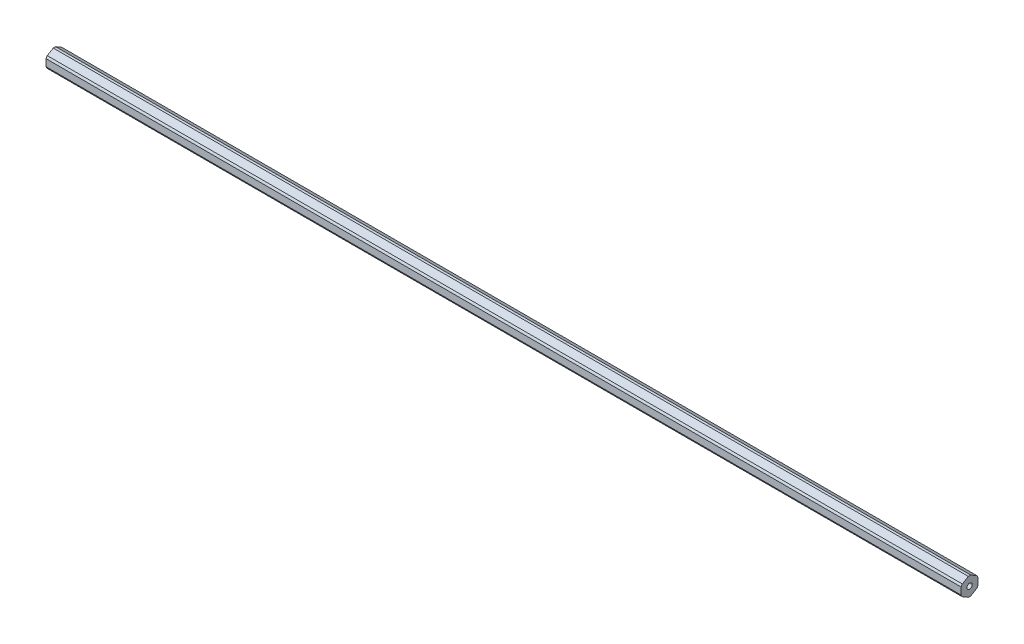
ISO-10303-21;
HEADER;
FILE_DESCRIPTION(('STEP AP214'),'2;1');
FILE_NAME('part.step','',(''),(''),'','','');
FILE_SCHEMA(('AUTOMOTIVE_DESIGN { 1 0 10303 214 1 1 1 1 }'));
ENDSEC;
DATA;
#1=APPLICATION_CONTEXT('core data for automotive mechanical design processes');
#2=APPLICATION_PROTOCOL_DEFINITION('international standard','automotive_design',2000,#1);
#3=PRODUCT_CONTEXT('',#1,'mechanical');
#4=PRODUCT('Part','Part','',(#3));
#5=PRODUCT_RELATED_PRODUCT_CATEGORY('part','',(#4));
#6=PRODUCT_DEFINITION_FORMATION('','',#4);
#7=PRODUCT_DEFINITION_CONTEXT('part definition',#1,'design');
#8=PRODUCT_DEFINITION('design','',#6,#7);
#9=PRODUCT_DEFINITION_SHAPE('','',#8);
#10=(LENGTH_UNIT() NAMED_UNIT(*) SI_UNIT(.MILLI.,.METRE.));
#11=(NAMED_UNIT(*) PLANE_ANGLE_UNIT() SI_UNIT($,.RADIAN.));
#12=(NAMED_UNIT(*) SI_UNIT($,.STERADIAN.) SOLID_ANGLE_UNIT());
#13=UNCERTAINTY_MEASURE_WITH_UNIT(LENGTH_MEASURE(1.E-05),#10,'distance_accuracy_value','');
#14=(GEOMETRIC_REPRESENTATION_CONTEXT(3) GLOBAL_UNCERTAINTY_ASSIGNED_CONTEXT((#13)) GLOBAL_UNIT_ASSIGNED_CONTEXT((#10,
#11,#12)) REPRESENTATION_CONTEXT('',''));
#15=CARTESIAN_POINT('',(0.,0.,0.));
#16=DIRECTION('',(0.,0.,1.));
#17=DIRECTION('',(1.,0.,0.));
#18=AXIS2_PLACEMENT_3D('',#15,#16,#17);
#19=CARTESIAN_POINT('',(344.4875,-42.7410300776045,144.981734412357));
#20=DIRECTION('',(0.,-0.866025403784439,0.5));
#21=DIRECTION('',(0.,-0.5,-0.866025403784439));
#22=AXIS2_PLACEMENT_3D('',#19,#20,#21);
#23=PLANE('',#22);
#24=DIRECTION('',(0.,0.5,0.866025403784439));
#25=VECTOR('',#24,1.);
#26=CARTESIAN_POINT('',(344.4875,-42.7410300776045,144.981734412357));
#27=LINE('',#26,#25);
#28=CARTESIAN_POINT('',(344.4875,-44.0578613347992,142.700915769901));
#29=VERTEX_POINT('',#28);
#30=CARTESIAN_POINT('',(344.4875,-41.4241988204098,147.262553054813));
#31=VERTEX_POINT('',#30);
#32=EDGE_CURVE('E193',#29,#31,#27,.T.);
#33=ORIENTED_EDGE('',*,*,#32,.T.);
#34=DIRECTION('',(-1.,0.,0.));
#35=VECTOR('',#34,1.);
#36=CARTESIAN_POINT('',(344.4875,-41.4241988204098,147.262553054813));
#37=LINE('',#36,#35);
#38=CARTESIAN_POINT('',(-344.4875,-41.4241988204097,147.262553054813));
#39=VERTEX_POINT('',#38);
#40=EDGE_CURVE('E186',#31,#39,#37,.T.);
#41=ORIENTED_EDGE('',*,*,#40,.T.);
#42=DIRECTION('',(0.,-0.5,-0.866025403784438));
#43=VECTOR('',#42,1.);
#44=CARTESIAN_POINT('',(-344.4875,-42.7410300776044,144.981734412357));
#45=LINE('',#44,#43);
#46=CARTESIAN_POINT('',(-344.4875,-44.0578613347991,142.700915769901));
#47=VERTEX_POINT('',#46);
#48=EDGE_CURVE('E139',#39,#47,#45,.T.);
#49=ORIENTED_EDGE('',*,*,#48,.T.);
#50=DIRECTION('',(-1.,0.,0.));
#51=VECTOR('',#50,1.);
#52=CARTESIAN_POINT('',(344.4875,-44.0578613347993,142.700915769901));
#53=LINE('',#52,#51);
#54=EDGE_CURVE('E182',#47,#29,#53,.F.);
#55=ORIENTED_EDGE('',*,*,#54,.T.);
#56=EDGE_LOOP('',(#33,#41,#49,#55));
#57=FACE_BOUND('',#56,.T.);
#58=ADVANCED_FACE('F17',(#57),#23,.T.);
#59=CARTESIAN_POINT('',(344.4875,-37.2412950776045,148.157007895079));
#60=DIRECTION('',(0.,0.,1.));
#61=DIRECTION('',(1.,0.,0.));
#62=AXIS2_PLACEMENT_3D('',#59,#60,#61);
#63=PLANE('',#62);
#64=DIRECTION('',(0.,1.,0.));
#65=VECTOR('',#64,1.);
#66=CARTESIAN_POINT('',(344.4875,-37.2412950776045,148.157007895079));
#67=LINE('',#66,#65);
#68=CARTESIAN_POINT('',(344.4875,-39.874957591994,148.157007895079));
#69=VERTEX_POINT('',#68);
#70=CARTESIAN_POINT('',(344.4875,-34.6076325632151,148.157007895079));
#71=VERTEX_POINT('',#70);
#72=EDGE_CURVE('E196',#69,#71,#67,.T.);
#73=ORIENTED_EDGE('',*,*,#72,.T.);
#74=DIRECTION('',(-1.,0.,0.));
#75=VECTOR('',#74,1.);
#76=CARTESIAN_POINT('',(344.4875,-34.6076325632151,148.157007895079));
#77=LINE('',#76,#75);
#78=CARTESIAN_POINT('',(-344.4875,-34.6076325632149,148.157007895079));
#79=VERTEX_POINT('',#78);
#80=EDGE_CURVE('E179',#71,#79,#77,.T.);
#81=ORIENTED_EDGE('',*,*,#80,.T.);
#82=DIRECTION('',(0.,-1.,0.));
#83=VECTOR('',#82,1.);
#84=CARTESIAN_POINT('',(-344.4875,-37.2412950776044,148.157007895079));
#85=LINE('',#84,#83);
#86=CARTESIAN_POINT('',(-344.4875,-39.8749575919938,148.157007895079));
#87=VERTEX_POINT('',#86);
#88=EDGE_CURVE('E124',#79,#87,#85,.T.);
#89=ORIENTED_EDGE('',*,*,#88,.T.);
#90=DIRECTION('',(-1.,0.,0.));
#91=VECTOR('',#90,1.);
#92=CARTESIAN_POINT('',(344.4875,-39.874957591994,148.157007895079));
#93=LINE('',#92,#91);
#94=EDGE_CURVE('E176',#87,#69,#93,.F.);
#95=ORIENTED_EDGE('',*,*,#94,.T.);
#96=EDGE_LOOP('',(#73,#81,#89,#95));
#97=FACE_BOUND('',#96,.T.);
#98=ADVANCED_FACE('F264',(#97),#63,.T.);
#99=CARTESIAN_POINT('',(344.4875,-31.7415600776046,144.981734412357));
#100=DIRECTION('',(0.,0.866025403784439,0.5));
#101=DIRECTION('',(0.,-0.5,0.866025403784439));
#102=AXIS2_PLACEMENT_3D('',#99,#100,#101);
#103=PLANE('',#102);
#104=DIRECTION('',(0.,0.5,-0.866025403784439));
#105=VECTOR('',#104,1.);
#106=CARTESIAN_POINT('',(344.4875,-31.7415600776046,144.981734412357));
#107=LINE('',#106,#105);
#108=CARTESIAN_POINT('',(344.4875,-33.0583913347992,147.262553054813));
#109=VERTEX_POINT('',#108);
#110=CARTESIAN_POINT('',(344.4875,-30.4247288204099,142.700915769901));
#111=VERTEX_POINT('',#110);
#112=EDGE_CURVE('E200',#109,#111,#107,.T.);
#113=ORIENTED_EDGE('',*,*,#112,.T.);
#114=DIRECTION('',(-1.,0.,0.));
#115=VECTOR('',#114,1.);
#116=CARTESIAN_POINT('',(344.4875,-30.4247288204099,142.700915769901));
#117=LINE('',#116,#115);
#118=CARTESIAN_POINT('',(-344.4875,-30.4247288204097,142.700915769901));
#119=VERTEX_POINT('',#118);
#120=EDGE_CURVE('E114',#111,#119,#117,.T.);
#121=ORIENTED_EDGE('',*,*,#120,.T.);
#122=DIRECTION('',(0.,-0.5,0.866025403784439));
#123=VECTOR('',#122,1.);
#124=CARTESIAN_POINT('',(-344.4875,-31.7415600776044,144.981734412357));
#125=LINE('',#124,#123);
#126=CARTESIAN_POINT('',(-344.4875,-33.0583913347991,147.262553054813));
#127=VERTEX_POINT('',#126);
#128=EDGE_CURVE('E121',#119,#127,#125,.T.);
#129=ORIENTED_EDGE('',*,*,#128,.T.);
#130=DIRECTION('',(-1.,0.,0.));
#131=VECTOR('',#130,1.);
#132=CARTESIAN_POINT('',(344.4875,-33.0583913347993,147.262553054813));
#133=LINE('',#132,#131);
#134=EDGE_CURVE('E104',#127,#109,#133,.F.);
#135=ORIENTED_EDGE('',*,*,#134,.T.);
#136=EDGE_LOOP('',(#113,#121,#129,#135));
#137=FACE_BOUND('',#136,.T.);
#138=ADVANCED_FACE('F130',(#137),#103,.T.);
#139=CARTESIAN_POINT('',(344.4875,-31.7415600776046,138.631187446914));
#140=DIRECTION('',(0.,0.866025403784439,-0.5));
#141=DIRECTION('',(0.,0.5,0.866025403784439));
#142=AXIS2_PLACEMENT_3D('',#139,#140,#141);
#143=PLANE('',#142);
#144=DIRECTION('',(0.,-0.5,-0.866025403784439));
#145=VECTOR('',#144,1.);
#146=CARTESIAN_POINT('',(344.4875,-31.7415600776046,138.631187446914));
#147=LINE('',#146,#145);
#148=CARTESIAN_POINT('',(344.4875,-30.4247288204099,140.91200608937));
#149=VERTEX_POINT('',#148);
#150=CARTESIAN_POINT('',(344.4875,-33.0583913347992,136.350368804458));
#151=VERTEX_POINT('',#150);
#152=EDGE_CURVE('E203',#149,#151,#147,.T.);
#153=ORIENTED_EDGE('',*,*,#152,.T.);
#154=DIRECTION('',(-1.,0.,0.));
#155=VECTOR('',#154,1.);
#156=CARTESIAN_POINT('',(344.4875,-33.0583913347993,136.350368804458));
#157=LINE('',#156,#155);
#158=CARTESIAN_POINT('',(-344.4875,-33.0583913347991,136.350368804458));
#159=VERTEX_POINT('',#158);
#160=EDGE_CURVE('E115',#151,#159,#157,.T.);
#161=ORIENTED_EDGE('',*,*,#160,.T.);
#162=DIRECTION('',(0.,0.5,0.866025403784439));
#163=VECTOR('',#162,1.);
#164=CARTESIAN_POINT('',(-344.4875,-31.7415600776044,138.631187446914));
#165=LINE('',#164,#163);
#166=CARTESIAN_POINT('',(-344.4875,-30.4247288204097,140.91200608937));
#167=VERTEX_POINT('',#166);
#168=EDGE_CURVE('E133',#159,#167,#165,.T.);
#169=ORIENTED_EDGE('',*,*,#168,.T.);
#170=DIRECTION('',(-1.,0.,0.));
#171=VECTOR('',#170,1.);
#172=CARTESIAN_POINT('',(344.4875,-30.4247288204099,140.91200608937));
#173=LINE('',#172,#171);
#174=EDGE_CURVE('E168',#167,#149,#173,.F.);
#175=ORIENTED_EDGE('',*,*,#174,.T.);
#176=EDGE_LOOP('',(#153,#161,#169,#175));
#177=FACE_BOUND('',#176,.T.);
#178=ADVANCED_FACE('F270',(#177),#143,.T.);
#179=CARTESIAN_POINT('',(344.4875,-37.2412950776045,135.455913964192));
#180=DIRECTION('',(0.,0.,-1.));
#181=DIRECTION('',(-1.,0.,0.));
#182=AXIS2_PLACEMENT_3D('',#179,#180,#181);
#183=PLANE('',#182);
#184=DIRECTION('',(0.,-1.,0.));
#185=VECTOR('',#184,1.);
#186=CARTESIAN_POINT('',(344.4875,-37.2412950776045,135.455913964192));
#187=LINE('',#186,#185);
#188=CARTESIAN_POINT('',(344.4875,-34.6076325632151,135.455913964192));
#189=VERTEX_POINT('',#188);
#190=CARTESIAN_POINT('',(344.4875,-39.874957591994,135.455913964192));
#191=VERTEX_POINT('',#190);
#192=EDGE_CURVE('E25',#189,#191,#187,.T.);
#193=ORIENTED_EDGE('',*,*,#192,.T.);
#194=DIRECTION('',(-1.,0.,0.));
#195=VECTOR('',#194,1.);
#196=CARTESIAN_POINT('',(344.4875,-39.874957591994,135.455913964192));
#197=LINE('',#196,#195);
#198=CARTESIAN_POINT('',(-344.4875,-39.8749575919938,135.455913964192));
#199=VERTEX_POINT('',#198);
#200=EDGE_CURVE('E165',#191,#199,#197,.T.);
#201=ORIENTED_EDGE('',*,*,#200,.T.);
#202=DIRECTION('',(0.,1.,0.));
#203=VECTOR('',#202,1.);
#204=CARTESIAN_POINT('',(-344.4875,-37.2412950776044,135.455913964192));
#205=LINE('',#204,#203);
#206=CARTESIAN_POINT('',(-344.4875,-34.6076325632149,135.455913964192));
#207=VERTEX_POINT('',#206);
#208=EDGE_CURVE('E143',#199,#207,#205,.T.);
#209=ORIENTED_EDGE('',*,*,#208,.T.);
#210=DIRECTION('',(-1.,0.,0.));
#211=VECTOR('',#210,1.);
#212=CARTESIAN_POINT('',(344.4875,-34.6076325632151,135.455913964192));
#213=LINE('',#212,#211);
#214=EDGE_CURVE('E161',#207,#189,#213,.F.);
#215=ORIENTED_EDGE('',*,*,#214,.T.);
#216=EDGE_LOOP('',(#193,#201,#209,#215));
#217=FACE_BOUND('',#216,.T.);
#218=ADVANCED_FACE('F211',(#217),#183,.T.);
#219=CARTESIAN_POINT('',(344.4875,-42.7410300776045,138.631187446914));
#220=DIRECTION('',(0.,-0.866025403784438,-0.5));
#221=DIRECTION('',(0.,0.5,-0.866025403784438));
#222=AXIS2_PLACEMENT_3D('',#219,#220,#221);
#223=PLANE('',#222);
#224=DIRECTION('',(0.,-0.5,0.866025403784438));
#225=VECTOR('',#224,1.);
#226=CARTESIAN_POINT('',(344.4875,-42.7410300776045,138.631187446914));
#227=LINE('',#226,#225);
#228=CARTESIAN_POINT('',(344.4875,-41.4241988204098,136.350368804458));
#229=VERTEX_POINT('',#228);
#230=CARTESIAN_POINT('',(344.4875,-44.0578613347992,140.91200608937));
#231=VERTEX_POINT('',#230);
#232=EDGE_CURVE('E11',#229,#231,#227,.T.);
#233=ORIENTED_EDGE('',*,*,#232,.T.);
#234=DIRECTION('',(-1.,0.,0.));
#235=VECTOR('',#234,1.);
#236=CARTESIAN_POINT('',(344.4875,-44.0578613347992,140.91200608937));
#237=LINE('',#236,#235);
#238=CARTESIAN_POINT('',(-344.4875,-44.0578613347991,140.91200608937));
#239=VERTEX_POINT('',#238);
#240=EDGE_CURVE('E158',#231,#239,#237,.T.);
#241=ORIENTED_EDGE('',*,*,#240,.T.);
#242=DIRECTION('',(0.,0.5,-0.866025403784439));
#243=VECTOR('',#242,1.);
#244=CARTESIAN_POINT('',(-344.4875,-42.7410300776044,138.631187446914));
#245=LINE('',#244,#243);
#246=CARTESIAN_POINT('',(-344.4875,-41.4241988204097,136.350368804458));
#247=VERTEX_POINT('',#246);
#248=EDGE_CURVE('E233',#239,#247,#245,.T.);
#249=ORIENTED_EDGE('',*,*,#248,.T.);
#250=DIRECTION('',(-1.,0.,0.));
#251=VECTOR('',#250,1.);
#252=CARTESIAN_POINT('',(344.4875,-41.4241988204098,136.350368804458));
#253=LINE('',#252,#251);
#254=EDGE_CURVE('E154',#247,#229,#253,.F.);
#255=ORIENTED_EDGE('',*,*,#254,.T.);
#256=EDGE_LOOP('',(#233,#241,#249,#255));
#257=FACE_BOUND('',#256,.T.);
#258=ADVANCED_FACE('F278',(#257),#223,.T.);
#259=CARTESIAN_POINT('',(344.4875,-37.2412950776045,141.806460929636));
#260=DIRECTION('',(-1.,0.,0.));
#261=DIRECTION('',(0.,-1.,0.));
#262=AXIS2_PLACEMENT_3D('',#259,#260,#261);
#263=PLANE('',#262);
#264=CARTESIAN_POINT('',(344.4875,-37.2412950776045,141.806460929636));
#265=DIRECTION('',(-1.,0.,0.));
#266=DIRECTION('',(0.,-1.,0.));
#267=AXIS2_PLACEMENT_3D('',#264,#265,#266);
#268=CIRCLE('',#267,2.);
#269=CARTESIAN_POINT('',(344.4875,-39.2412950776045,141.806460929636));
#270=VERTEX_POINT('',#269);
#271=EDGE_CURVE('E189',#270,#270,#268,.T.);
#272=ORIENTED_EDGE('',*,*,#271,.T.);
#273=EDGE_LOOP('',(#272));
#274=FACE_BOUND('',#273,.T.);
#275=CARTESIAN_POINT('',(344.4875,-37.2412950776045,141.806460929636));
#276=DIRECTION('',(-1.,0.,0.));
#277=DIRECTION('',(0.,-1.,0.));
#278=AXIS2_PLACEMENT_3D('',#275,#276,#277);
#279=CIRCLE('',#278,6.875);
#280=EDGE_CURVE('E32',#31,#69,#279,.T.);
#281=ORIENTED_EDGE('',*,*,#280,.F.);
#282=ORIENTED_EDGE('',*,*,#32,.F.);
#283=EDGE_CURVE('E150',#231,#29,#279,.T.);
#284=ORIENTED_EDGE('',*,*,#283,.F.);
#285=ORIENTED_EDGE('',*,*,#232,.F.);
#286=EDGE_CURVE('E153',#191,#229,#279,.T.);
#287=ORIENTED_EDGE('',*,*,#286,.F.);
#288=ORIENTED_EDGE('',*,*,#192,.F.);
#289=EDGE_CURVE('E219',#151,#189,#279,.T.);
#290=ORIENTED_EDGE('',*,*,#289,.F.);
#291=ORIENTED_EDGE('',*,*,#152,.F.);
#292=EDGE_CURVE('E225',#111,#149,#279,.T.);
#293=ORIENTED_EDGE('',*,*,#292,.F.);
#294=ORIENTED_EDGE('',*,*,#112,.F.);
#295=EDGE_CURVE('E40',#71,#109,#279,.T.);
#296=ORIENTED_EDGE('',*,*,#295,.F.);
#297=ORIENTED_EDGE('',*,*,#72,.F.);
#298=EDGE_LOOP('',(#281,#282,#284,#285,#287,#288,#290,#291,#293,#294,#296,#297));
#299=FACE_BOUND('',#298,.T.);
#300=ADVANCED_FACE('F217',(#274,#299),#263,.F.);
#301=CARTESIAN_POINT('',(344.4875,-37.2412950776045,141.806460929636));
#302=DIRECTION('',(-1.,0.,0.));
#303=DIRECTION('',(0.,-1.,0.));
#304=AXIS2_PLACEMENT_3D('',#301,#302,#303);
#305=CYLINDRICAL_SURFACE('',#304,2.);
#306=ORIENTED_EDGE('',*,*,#271,.F.);
#307=EDGE_LOOP('',(#306));
#308=FACE_BOUND('',#307,.T.);
#309=CARTESIAN_POINT('',(-344.4875,-37.2412950776044,141.806460929636));
#310=DIRECTION('',(1.,0.,0.));
#311=DIRECTION('',(0.,1.,0.));
#312=AXIS2_PLACEMENT_3D('',#309,#310,#311);
#313=CIRCLE('',#312,2.);
#314=CARTESIAN_POINT('',(-344.4875,-35.2412950776044,141.806460929636));
#315=VERTEX_POINT('',#314);
#316=EDGE_CURVE('E126',#315,#315,#313,.T.);
#317=ORIENTED_EDGE('',*,*,#316,.F.);
#318=EDGE_LOOP('',(#317));
#319=FACE_BOUND('',#318,.T.);
#320=ADVANCED_FACE('F284',(#308,#319),#305,.F.);
#321=CARTESIAN_POINT('',(344.4875,-37.2412950776045,141.806460929636));
#322=DIRECTION('',(-1.,0.,0.));
#323=DIRECTION('',(0.,-1.,0.));
#324=AXIS2_PLACEMENT_3D('',#321,#322,#323);
#325=CYLINDRICAL_SURFACE('',#324,6.875);
#326=ORIENTED_EDGE('',*,*,#286,.T.);
#327=ORIENTED_EDGE('',*,*,#254,.F.);
#328=CARTESIAN_POINT('',(-344.4875,-37.2412950776044,141.806460929636));
#329=DIRECTION('',(1.,0.,0.));
#330=DIRECTION('',(0.,1.,0.));
#331=AXIS2_PLACEMENT_3D('',#328,#329,#330);
#332=CIRCLE('',#331,6.875);
#333=EDGE_CURVE('E246',#247,#199,#332,.T.);
#334=ORIENTED_EDGE('',*,*,#333,.T.);
#335=ORIENTED_EDGE('',*,*,#200,.F.);
#336=EDGE_LOOP('',(#326,#327,#334,#335));
#337=FACE_BOUND('',#336,.T.);
#338=ADVANCED_FACE('F288',(#337),#325,.T.);
#339=ORIENTED_EDGE('',*,*,#54,.F.);
#340=EDGE_CURVE('E250',#47,#239,#332,.T.);
#341=ORIENTED_EDGE('',*,*,#340,.T.);
#342=ORIENTED_EDGE('',*,*,#240,.F.);
#343=ORIENTED_EDGE('',*,*,#283,.T.);
#344=EDGE_LOOP('',(#339,#341,#342,#343));
#345=FACE_BOUND('',#344,.T.);
#346=ADVANCED_FACE('F290',(#345),#325,.T.);
#347=ORIENTED_EDGE('',*,*,#289,.T.);
#348=ORIENTED_EDGE('',*,*,#214,.F.);
#349=EDGE_CURVE('E242',#207,#159,#332,.T.);
#350=ORIENTED_EDGE('',*,*,#349,.T.);
#351=ORIENTED_EDGE('',*,*,#160,.F.);
#352=EDGE_LOOP('',(#347,#348,#350,#351));
#353=FACE_BOUND('',#352,.T.);
#354=ADVANCED_FACE('F293',(#353),#325,.T.);
#355=ORIENTED_EDGE('',*,*,#292,.T.);
#356=ORIENTED_EDGE('',*,*,#174,.F.);
#357=EDGE_CURVE('E129',#167,#119,#332,.T.);
#358=ORIENTED_EDGE('',*,*,#357,.T.);
#359=ORIENTED_EDGE('',*,*,#120,.F.);
#360=EDGE_LOOP('',(#355,#356,#358,#359));
#361=FACE_BOUND('',#360,.T.);
#362=ADVANCED_FACE('F302',(#361),#325,.T.);
#363=ORIENTED_EDGE('',*,*,#295,.T.);
#364=ORIENTED_EDGE('',*,*,#134,.F.);
#365=EDGE_CURVE('E107',#127,#79,#332,.T.);
#366=ORIENTED_EDGE('',*,*,#365,.T.);
#367=ORIENTED_EDGE('',*,*,#80,.F.);
#368=EDGE_LOOP('',(#363,#364,#366,#367));
#369=FACE_BOUND('',#368,.T.);
#370=ADVANCED_FACE('F106',(#369),#325,.T.);
#371=ORIENTED_EDGE('',*,*,#280,.T.);
#372=ORIENTED_EDGE('',*,*,#94,.F.);
#373=EDGE_CURVE('E127',#87,#39,#332,.T.);
#374=ORIENTED_EDGE('',*,*,#373,.T.);
#375=ORIENTED_EDGE('',*,*,#40,.F.);
#376=EDGE_LOOP('',(#371,#372,#374,#375));
#377=FACE_BOUND('',#376,.T.);
#378=ADVANCED_FACE('F259',(#377),#325,.T.);
#379=CARTESIAN_POINT('',(-344.4875,-37.2412950776044,141.806460929636));
#380=DIRECTION('',(1.,0.,0.));
#381=DIRECTION('',(0.,-1.,0.));
#382=AXIS2_PLACEMENT_3D('',#379,#380,#381);
#383=PLANE('',#382);
#384=ORIENTED_EDGE('',*,*,#316,.T.);
#385=EDGE_LOOP('',(#384));
#386=FACE_BOUND('',#385,.T.);
#387=ORIENTED_EDGE('',*,*,#365,.F.);
#388=ORIENTED_EDGE('',*,*,#128,.F.);
#389=ORIENTED_EDGE('',*,*,#357,.F.);
#390=ORIENTED_EDGE('',*,*,#168,.F.);
#391=ORIENTED_EDGE('',*,*,#349,.F.);
#392=ORIENTED_EDGE('',*,*,#208,.F.);
#393=ORIENTED_EDGE('',*,*,#333,.F.);
#394=ORIENTED_EDGE('',*,*,#248,.F.);
#395=ORIENTED_EDGE('',*,*,#340,.F.);
#396=ORIENTED_EDGE('',*,*,#48,.F.);
#397=ORIENTED_EDGE('',*,*,#373,.F.);
#398=ORIENTED_EDGE('',*,*,#88,.F.);
#399=EDGE_LOOP('',(#387,#388,#389,#390,#391,#392,#393,#394,#395,#396,#397,#398));
#400=FACE_BOUND('',#399,.T.);
#401=ADVANCED_FACE('F119',(#386,#400),#383,.F.);
#402=CLOSED_SHELL('',(#58,#98,#138,#178,#218,#258,#300,#320,#338,#346,#354,#362,#370,#378,#401));
#403=MANIFOLD_SOLID_BREP('B1',#402);
#404=ADVANCED_BREP_SHAPE_REPRESENTATION('',(#18,#403),#14);
#405=SHAPE_DEFINITION_REPRESENTATION(#9,#404);
ENDSEC;
END-ISO-10303-21;
